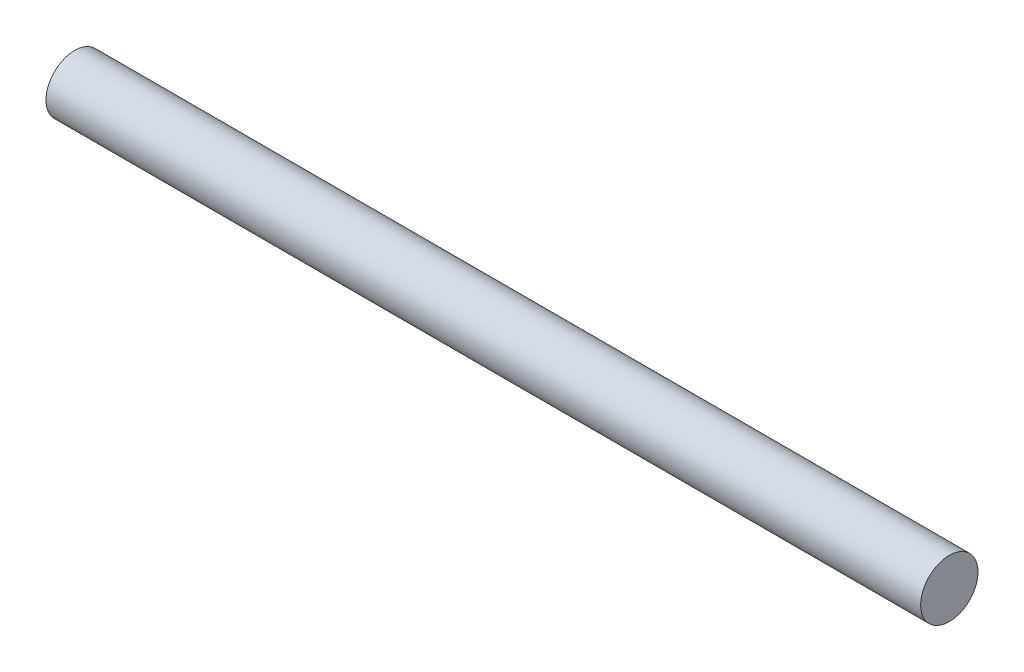
ISO-10303-21;
HEADER;
FILE_DESCRIPTION(('STEP AP214'),'2;1');
FILE_NAME('part.step','',(''),(''),'','','');
FILE_SCHEMA(('AUTOMOTIVE_DESIGN { 1 0 10303 214 1 1 1 1 }'));
ENDSEC;
DATA;
#1=APPLICATION_CONTEXT('core data for automotive mechanical design processes');
#2=APPLICATION_PROTOCOL_DEFINITION('international standard','automotive_design',2000,#1);
#3=PRODUCT_CONTEXT('',#1,'mechanical');
#4=PRODUCT('Part','Part','',(#3));
#5=PRODUCT_RELATED_PRODUCT_CATEGORY('part','',(#4));
#6=PRODUCT_DEFINITION_FORMATION('','',#4);
#7=PRODUCT_DEFINITION_CONTEXT('part definition',#1,'design');
#8=PRODUCT_DEFINITION('design','',#6,#7);
#9=PRODUCT_DEFINITION_SHAPE('','',#8);
#10=(LENGTH_UNIT() NAMED_UNIT(*) SI_UNIT(.MILLI.,.METRE.));
#11=(NAMED_UNIT(*) PLANE_ANGLE_UNIT() SI_UNIT($,.RADIAN.));
#12=(NAMED_UNIT(*) SI_UNIT($,.STERADIAN.) SOLID_ANGLE_UNIT());
#13=UNCERTAINTY_MEASURE_WITH_UNIT(LENGTH_MEASURE(1.E-05),#10,'distance_accuracy_value','');
#14=(GEOMETRIC_REPRESENTATION_CONTEXT(3) GLOBAL_UNCERTAINTY_ASSIGNED_CONTEXT((#13)) GLOBAL_UNIT_ASSIGNED_CONTEXT((#10,
#11,#12)) REPRESENTATION_CONTEXT('',''));
#15=CARTESIAN_POINT('',(0.,0.,0.));
#16=DIRECTION('',(0.,0.,1.));
#17=DIRECTION('',(1.,0.,0.));
#18=AXIS2_PLACEMENT_3D('',#15,#16,#17);
#19=CARTESIAN_POINT('',(38.1,0.,0.));
#20=DIRECTION('',(-1.,0.,0.));
#21=DIRECTION('',(0.,0.,1.));
#22=AXIS2_PLACEMENT_3D('',#19,#20,#21);
#23=CYLINDRICAL_SURFACE('',#22,2.5);
#24=CARTESIAN_POINT('',(38.1,0.,0.));
#25=DIRECTION('',(1.,0.,0.));
#26=DIRECTION('',(0.,0.,-1.));
#27=AXIS2_PLACEMENT_3D('',#24,#25,#26);
#28=CIRCLE('',#27,2.5);
#29=CARTESIAN_POINT('',(38.1,0.,2.5));
#30=VERTEX_POINT('',#29);
#31=EDGE_CURVE('E10',#30,#30,#28,.T.);
#32=CARTESIAN_POINT('',(-38.1,0.,0.));
#33=DIRECTION('',(1.,0.,0.));
#34=DIRECTION('',(0.,0.,-1.));
#35=AXIS2_PLACEMENT_3D('',#32,#33,#34);
#36=CIRCLE('',#35,2.5);
#37=CARTESIAN_POINT('',(-38.1,0.,2.5));
#38=VERTEX_POINT('',#37);
#39=EDGE_CURVE('E44',#38,#38,#36,.T.);
#40=CARTESIAN_POINT('',(38.1,0.,2.5));
#41=CARTESIAN_POINT('',(37.30625,0.,2.5));
#42=CARTESIAN_POINT('',(36.5125,0.,2.5));
#43=CARTESIAN_POINT('',(34.925,0.,2.5));
#44=CARTESIAN_POINT('',(34.13125,0.,2.5));
#45=CARTESIAN_POINT('',(32.54375,0.,2.5));
#46=CARTESIAN_POINT('',(31.75,0.,2.5));
#47=CARTESIAN_POINT('',(30.1625,0.,2.5));
#48=CARTESIAN_POINT('',(29.36875,0.,2.5));
#49=CARTESIAN_POINT('',(27.78125,0.,2.5));
#50=CARTESIAN_POINT('',(26.9875,0.,2.5));
#51=CARTESIAN_POINT('',(25.4,0.,2.5));
#52=CARTESIAN_POINT('',(24.60625,0.,2.5));
#53=CARTESIAN_POINT('',(23.01875,0.,2.5));
#54=CARTESIAN_POINT('',(22.225,0.,2.5));
#55=CARTESIAN_POINT('',(20.6375,0.,2.5));
#56=CARTESIAN_POINT('',(19.84375,0.,2.5));
#57=CARTESIAN_POINT('',(18.25625,0.,2.5));
#58=CARTESIAN_POINT('',(17.4625,0.,2.5));
#59=CARTESIAN_POINT('',(15.875,0.,2.5));
#60=CARTESIAN_POINT('',(15.08125,0.,2.5));
#61=CARTESIAN_POINT('',(13.49375,0.,2.5));
#62=CARTESIAN_POINT('',(12.7,0.,2.5));
#63=CARTESIAN_POINT('',(11.1125,0.,2.5));
#64=CARTESIAN_POINT('',(10.31875,0.,2.5));
#65=CARTESIAN_POINT('',(8.73124999999999,0.,2.5));
#66=CARTESIAN_POINT('',(7.93749999999999,0.,2.5));
#67=CARTESIAN_POINT('',(6.35,0.,2.5));
#68=CARTESIAN_POINT('',(5.55625,0.,2.5));
#69=CARTESIAN_POINT('',(3.96875,0.,2.5));
#70=CARTESIAN_POINT('',(3.175,0.,2.5));
#71=CARTESIAN_POINT('',(1.5875,0.,2.5));
#72=CARTESIAN_POINT('',(0.793750000000001,0.,2.5));
#73=CARTESIAN_POINT('',(-0.793750000000001,0.,2.5));
#74=CARTESIAN_POINT('',(-1.5875,0.,2.5));
#75=CARTESIAN_POINT('',(-3.175,0.,2.5));
#76=CARTESIAN_POINT('',(-3.96875,0.,2.5));
#77=CARTESIAN_POINT('',(-5.55625,0.,2.5));
#78=CARTESIAN_POINT('',(-6.35,0.,2.5));
#79=CARTESIAN_POINT('',(-7.93750000000001,0.,2.5));
#80=CARTESIAN_POINT('',(-8.73125,0.,2.5));
#81=CARTESIAN_POINT('',(-10.31875,0.,2.5));
#82=CARTESIAN_POINT('',(-11.1125,0.,2.5));
#83=CARTESIAN_POINT('',(-12.7,0.,2.5));
#84=CARTESIAN_POINT('',(-13.49375,0.,2.5));
#85=CARTESIAN_POINT('',(-15.08125,0.,2.5));
#86=CARTESIAN_POINT('',(-15.875,0.,2.5));
#87=CARTESIAN_POINT('',(-17.4625,0.,2.5));
#88=CARTESIAN_POINT('',(-18.25625,0.,2.5));
#89=CARTESIAN_POINT('',(-19.84375,0.,2.5));
#90=CARTESIAN_POINT('',(-20.6375,0.,2.5));
#91=CARTESIAN_POINT('',(-22.225,0.,2.5));
#92=CARTESIAN_POINT('',(-23.01875,0.,2.5));
#93=CARTESIAN_POINT('',(-24.60625,0.,2.5));
#94=CARTESIAN_POINT('',(-25.4,0.,2.5));
#95=CARTESIAN_POINT('',(-26.9875,0.,2.5));
#96=CARTESIAN_POINT('',(-27.78125,0.,2.5));
#97=CARTESIAN_POINT('',(-29.36875,0.,2.5));
#98=CARTESIAN_POINT('',(-30.1625,0.,2.5));
#99=CARTESIAN_POINT('',(-31.75,0.,2.5));
#100=CARTESIAN_POINT('',(-32.54375,0.,2.5));
#101=CARTESIAN_POINT('',(-34.13125,0.,2.5));
#102=CARTESIAN_POINT('',(-34.925,0.,2.5));
#103=CARTESIAN_POINT('',(-36.5125,0.,2.5));
#104=CARTESIAN_POINT('',(-37.30625,0.,2.5));
#105=CARTESIAN_POINT('',(-38.1,0.,2.5));
#106=B_SPLINE_CURVE_WITH_KNOTS('',3,(#40,#41,#42,#43,#44,#45,#46,#47,#48,#49,#50,#51,#52,#53,
#54,#55,#56,#57,#58,#59,#60,#61,#62,#63,#64,#65,#66,#67,#68,#69,#70,#71,#72,#73,#74,#75,#76,#77,
#78,#79,#80,#81,#82,#83,#84,#85,#86,#87,#88,#89,#90,#91,#92,#93,#94,#95,#96,#97,#98,#99,#100,
#101,#102,#103,#104,#105),.UNSPECIFIED.,.F.,.F.,(4,2,2,2,2,2,2,2,2,2,2,2,2,2,2,2,2,2,2,2,2,2,2,
2,2,2,2,2,2,2,2,2,4),(0.,2.38125,4.7625,7.14375,9.52500000000001,11.90625,14.2875,16.66875,
19.05,21.43125,23.8125,26.19375,28.575,30.95625,33.3375,35.71875,38.1,40.48125,42.8625,45.24375,
47.625,50.00625,52.3875,54.76875,57.15,59.53125,61.9125,64.29375,66.675,69.05625,71.4375,
73.81875,76.2),.UNSPECIFIED.);
#107=EDGE_CURVE('BSEAM41',#30,#38,#106,.T.);
#108=ORIENTED_EDGE('',*,*,#31,.F.);
#109=ORIENTED_EDGE('',*,*,#39,.T.);
#110=ORIENTED_EDGE('',*,*,#107,.T.);
#111=ORIENTED_EDGE('',*,*,#107,.F.);
#112=EDGE_LOOP('',(#108,#110,#109,#111));
#113=FACE_BOUND('',#112,.T.);
#114=ADVANCED_FACE('F41',(#113),#23,.T.);
#115=CARTESIAN_POINT('',(38.1,0.,0.));
#116=DIRECTION('',(1.,0.,0.));
#117=DIRECTION('',(0.,0.,-1.));
#118=AXIS2_PLACEMENT_3D('',#115,#116,#117);
#119=PLANE('',#118);
#120=ORIENTED_EDGE('',*,*,#31,.T.);
#121=EDGE_LOOP('',(#120));
#122=FACE_BOUND('',#121,.T.);
#123=ADVANCED_FACE('F56',(#122),#119,.T.);
#124=CARTESIAN_POINT('',(-38.1,0.,0.));
#125=DIRECTION('',(1.,0.,0.));
#126=DIRECTION('',(0.,0.,-1.));
#127=AXIS2_PLACEMENT_3D('',#124,#125,#126);
#128=PLANE('',#127);
#129=ORIENTED_EDGE('',*,*,#39,.F.);
#130=EDGE_LOOP('',(#129));
#131=FACE_BOUND('',#130,.T.);
#132=ADVANCED_FACE('F54',(#131),#128,.F.);
#133=CLOSED_SHELL('',(#114,#123,#132));
#134=MANIFOLD_SOLID_BREP('B2',#133);
#135=ADVANCED_BREP_SHAPE_REPRESENTATION('',(#18,#134),#14);
#136=SHAPE_DEFINITION_REPRESENTATION(#9,#135);
ENDSEC;
END-ISO-10303-21;
